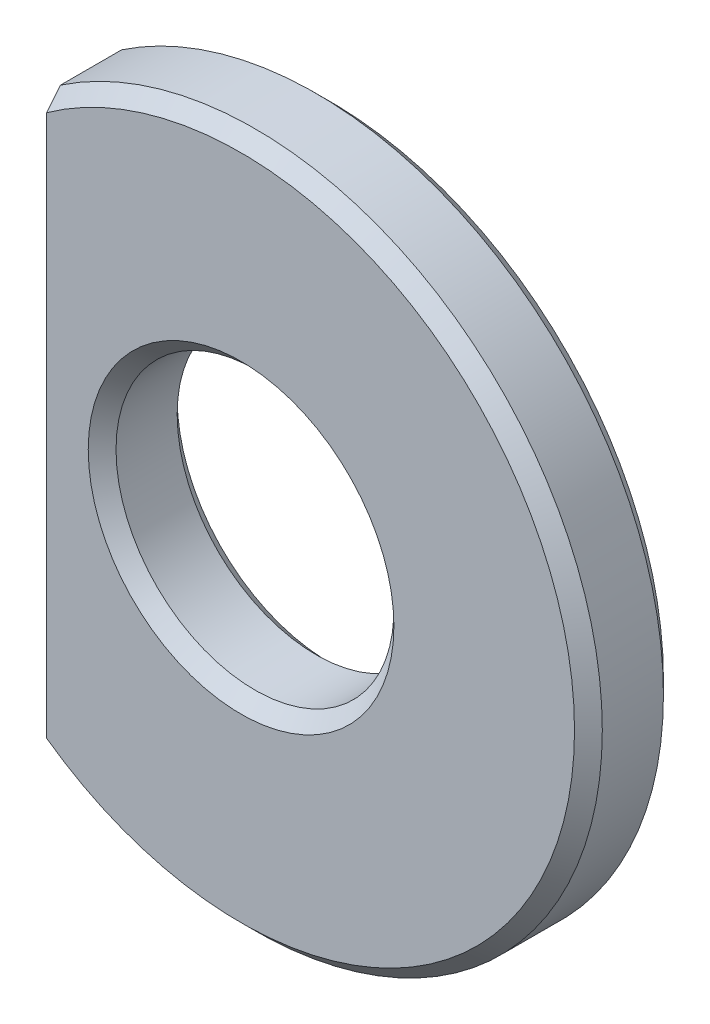
ISO-10303-21;
HEADER;
FILE_DESCRIPTION(('STEP AP214'),'2;1');
FILE_NAME('part.step','',(''),(''),'','','');
FILE_SCHEMA(('AUTOMOTIVE_DESIGN { 1 0 10303 214 1 1 1 1 }'));
ENDSEC;
DATA;
#1=APPLICATION_CONTEXT('core data for automotive mechanical design processes');
#2=APPLICATION_PROTOCOL_DEFINITION('international standard','automotive_design',2000,#1);
#3=PRODUCT_CONTEXT('',#1,'mechanical');
#4=PRODUCT('Part','Part','',(#3));
#5=PRODUCT_RELATED_PRODUCT_CATEGORY('part','',(#4));
#6=PRODUCT_DEFINITION_FORMATION('','',#4);
#7=PRODUCT_DEFINITION_CONTEXT('part definition',#1,'design');
#8=PRODUCT_DEFINITION('design','',#6,#7);
#9=PRODUCT_DEFINITION_SHAPE('','',#8);
#10=(LENGTH_UNIT() NAMED_UNIT(*) SI_UNIT(.MILLI.,.METRE.));
#11=(NAMED_UNIT(*) PLANE_ANGLE_UNIT() SI_UNIT($,.RADIAN.));
#12=(NAMED_UNIT(*) SI_UNIT($,.STERADIAN.) SOLID_ANGLE_UNIT());
#13=UNCERTAINTY_MEASURE_WITH_UNIT(LENGTH_MEASURE(1.E-05),#10,'distance_accuracy_value','');
#14=(GEOMETRIC_REPRESENTATION_CONTEXT(3) GLOBAL_UNCERTAINTY_ASSIGNED_CONTEXT((#13)) GLOBAL_UNIT_ASSIGNED_CONTEXT((#10,
#11,#12)) REPRESENTATION_CONTEXT('',''));
#15=CARTESIAN_POINT('',(0.,0.,0.));
#16=DIRECTION('',(0.,0.,1.));
#17=DIRECTION('',(1.,0.,0.));
#18=AXIS2_PLACEMENT_3D('',#15,#16,#17);
#19=CARTESIAN_POINT('',(0.,0.,-3.2));
#20=DIRECTION('',(0.,0.,-1.));
#21=DIRECTION('',(-1.,0.,0.));
#22=AXIS2_PLACEMENT_3D('',#19,#20,#21);
#23=CONICAL_SURFACE('',#22,5.5,0.785398163397447);
#24=CARTESIAN_POINT('',(0.,0.,-2.7));
#25=DIRECTION('',(0.,0.,-1.));
#26=DIRECTION('',(-1.,0.,0.));
#27=AXIS2_PLACEMENT_3D('',#24,#25,#26);
#28=CIRCLE('',#27,5.);
#29=CARTESIAN_POINT('',(-5.,0.,-2.7));
#30=VERTEX_POINT('',#29);
#31=EDGE_CURVE('E46',#30,#30,#28,.T.);
#32=ORIENTED_EDGE('',*,*,#31,.F.);
#33=EDGE_LOOP('',(#32));
#34=FACE_BOUND('',#33,.T.);
#35=CARTESIAN_POINT('',(0.,0.,-3.2));
#36=DIRECTION('',(0.,0.,-1.));
#37=DIRECTION('',(-1.,0.,0.));
#38=AXIS2_PLACEMENT_3D('',#35,#36,#37);
#39=CIRCLE('',#38,5.5);
#40=CARTESIAN_POINT('',(-5.5,0.,-3.2));
#41=VERTEX_POINT('',#40);
#42=EDGE_CURVE('E81',#41,#41,#39,.T.);
#43=ORIENTED_EDGE('',*,*,#42,.T.);
#44=EDGE_LOOP('',(#43));
#45=FACE_BOUND('',#44,.T.);
#46=ADVANCED_FACE('F39',(#34,#45),#23,.F.);
#47=CARTESIAN_POINT('',(0.,0.,3.));
#48=DIRECTION('',(0.,0.,-1.));
#49=DIRECTION('',(-1.,0.,0.));
#50=AXIS2_PLACEMENT_3D('',#47,#48,#49);
#51=CYLINDRICAL_SURFACE('',#50,5.);
#52=CARTESIAN_POINT('',(0.,0.,-0.5));
#53=DIRECTION('',(0.,0.,-1.));
#54=DIRECTION('',(-1.,0.,0.));
#55=AXIS2_PLACEMENT_3D('',#52,#53,#54);
#56=CIRCLE('',#55,5.);
#57=CARTESIAN_POINT('',(-5.,0.,-0.5));
#58=VERTEX_POINT('',#57);
#59=EDGE_CURVE('E100',#58,#58,#56,.T.);
#60=ORIENTED_EDGE('',*,*,#59,.F.);
#61=EDGE_LOOP('',(#60));
#62=FACE_BOUND('',#61,.T.);
#63=ORIENTED_EDGE('',*,*,#31,.T.);
#64=EDGE_LOOP('',(#63));
#65=FACE_BOUND('',#64,.T.);
#66=ADVANCED_FACE('F109',(#62,#65),#51,.F.);
#67=CARTESIAN_POINT('',(0.,0.,-0.5));
#68=DIRECTION('',(0.,0.,1.));
#69=DIRECTION('',(1.,0.,0.));
#70=AXIS2_PLACEMENT_3D('',#67,#68,#69);
#71=CONICAL_SURFACE('',#70,5.,0.785398163397448);
#72=CARTESIAN_POINT('',(0.,0.,0.));
#73=DIRECTION('',(0.,0.,-1.));
#74=DIRECTION('',(-1.,0.,0.));
#75=AXIS2_PLACEMENT_3D('',#72,#73,#74);
#76=CIRCLE('',#75,5.5);
#77=CARTESIAN_POINT('',(-5.5,0.,0.));
#78=VERTEX_POINT('',#77);
#79=EDGE_CURVE('E93',#78,#78,#76,.T.);
#80=ORIENTED_EDGE('',*,*,#79,.F.);
#81=EDGE_LOOP('',(#80));
#82=FACE_BOUND('',#81,.T.);
#83=ORIENTED_EDGE('',*,*,#59,.T.);
#84=EDGE_LOOP('',(#83));
#85=FACE_BOUND('',#84,.T.);
#86=ADVANCED_FACE('F164',(#82,#85),#71,.F.);
#87=CARTESIAN_POINT('',(5.5,0.,0.));
#88=DIRECTION('',(0.,0.,-1.));
#89=DIRECTION('',(-1.,0.,0.));
#90=AXIS2_PLACEMENT_3D('',#87,#88,#89);
#91=PLANE('',#90);
#92=CARTESIAN_POINT('',(0.,0.,0.));
#93=DIRECTION('',(0.,0.,-1.));
#94=DIRECTION('',(-1.,0.,0.));
#95=AXIS2_PLACEMENT_3D('',#92,#93,#94);
#96=CIRCLE('',#95,12.);
#97=CARTESIAN_POINT('',(-7.,9.74679434480896,0.));
#98=VERTEX_POINT('',#97);
#99=CARTESIAN_POINT('',(-7.,-9.74679434480896,0.));
#100=VERTEX_POINT('',#99);
#101=EDGE_CURVE('E89',#98,#100,#96,.T.);
#102=ORIENTED_EDGE('',*,*,#101,.F.);
#103=DIRECTION('',(0.,1.,0.));
#104=VECTOR('',#103,1.);
#105=CARTESIAN_POINT('',(-7.,-12.5,0.));
#106=LINE('',#105,#104);
#107=EDGE_CURVE('E77',#100,#98,#106,.T.);
#108=ORIENTED_EDGE('',*,*,#107,.F.);
#109=EDGE_LOOP('',(#102,#108));
#110=FACE_BOUND('',#109,.T.);
#111=ORIENTED_EDGE('',*,*,#79,.T.);
#112=EDGE_LOOP('',(#111));
#113=FACE_BOUND('',#112,.T.);
#114=ADVANCED_FACE('F88',(#110,#113),#91,.F.);
#115=CARTESIAN_POINT('',(0.,0.,0.));
#116=DIRECTION('',(0.,0.,-1.));
#117=DIRECTION('',(-1.,0.,0.));
#118=AXIS2_PLACEMENT_3D('',#115,#116,#117);
#119=CONICAL_SURFACE('',#118,12.,0.785398163397449);
#120=CARTESIAN_POINT('',(0.,0.,-0.5));
#121=DIRECTION('',(0.,0.,-1.));
#122=DIRECTION('',(-1.,0.,0.));
#123=AXIS2_PLACEMENT_3D('',#120,#121,#122);
#124=CIRCLE('',#123,12.5);
#125=CARTESIAN_POINT('',(-7.,10.356157588604,-0.5));
#126=VERTEX_POINT('',#125);
#127=CARTESIAN_POINT('',(-7.,-10.356157588604,-0.5));
#128=VERTEX_POINT('',#127);
#129=EDGE_CURVE('E92',#126,#128,#124,.T.);
#130=ORIENTED_EDGE('',*,*,#129,.F.);
#131=CARTESIAN_POINT('',(-7.,26.5974809660874,-15.50319970006));
#132=CARTESIAN_POINT('',(-7.,25.9975601645188,-14.9230677102815));
#133=CARTESIAN_POINT('',(-7.,25.397034098777,-14.3435595993783));
#134=CARTESIAN_POINT('',(-7.,24.1944142104764,-13.1861575101449));
#135=CARTESIAN_POINT('',(-7.,23.5923203682057,-12.6082635523008));
#136=CARTESIAN_POINT('',(-7.,22.3859206829967,-11.4541817687792));
#137=CARTESIAN_POINT('',(-7.,21.7816138828933,-10.8779949430382));
#138=CARTESIAN_POINT('',(-7.,20.5705923015512,-9.72816347357322));
#139=CARTESIAN_POINT('',(-7.,19.96387753549,-9.15451881387426));
#140=CARTESIAN_POINT('',(-7.,18.7592982521687,-8.02174047025647));
#141=CARTESIAN_POINT('',(-7.,18.1614937970523,-7.46254298391141));
#142=CARTESIAN_POINT('',(-7.,16.962017387273,-6.34831574624053));
#143=CARTESIAN_POINT('',(-7.,16.3603454583649,-5.79328596721406));
#144=CARTESIAN_POINT('',(-7.,15.1519700044687,-4.68897071579282));
#145=CARTESIAN_POINT('',(-7.,14.5452675674347,-4.13968405658092));
#146=CARTESIAN_POINT('',(-7.,13.6298908788917,-3.32172776162674));
#147=CARTESIAN_POINT('',(-7.,13.3238823328356,-3.05007492501876));
#148=CARTESIAN_POINT('',(-7.,12.7097423204301,-2.50918102955164));
#149=CARTESIAN_POINT('',(-7.,12.4016108714768,-2.23993995097081));
#150=CARTESIAN_POINT('',(-7.,11.9003389753215,-1.80611633640955));
#151=CARTESIAN_POINT('',(-7.,11.7079811956367,-1.64062944169334));
#152=CARTESIAN_POINT('',(-7.,11.3221618703078,-1.31094731436415));
#153=CARTESIAN_POINT('',(-7.,11.1287003243016,-1.14675208217482));
#154=CARTESIAN_POINT('',(-7.,10.5464167887475,-0.656341000157183));
#155=CARTESIAN_POINT('',(-7.,10.1557313100695,-0.332330516521065));
#156=CARTESIAN_POINT('',(-7.,9.36382680573523,0.31123271704682));
#157=CARTESIAN_POINT('',(-7.,8.96254022968294,0.630702835798519));
#158=CARTESIAN_POINT('',(-7.,8.35420120513129,1.10154501364449));
#159=CARTESIAN_POINT('',(-7.,8.15037356769272,1.25708378226441));
#160=CARTESIAN_POINT('',(-7.,7.74022545682281,1.56483468612607));
#161=CARTESIAN_POINT('',(-7.,7.53390505206734,1.71704691269117));
#162=CARTESIAN_POINT('',(-7.,7.11523062232355,2.01975562754734));
#163=CARTESIAN_POINT('',(-7.,6.90283253853249,2.17019132352292));
#164=CARTESIAN_POINT('',(-7.,6.4745641534718,2.46606053067388));
#165=CARTESIAN_POINT('',(-7.,6.25869378952942,2.6114939514119));
#166=CARTESIAN_POINT('',(-7.,5.82260003389805,2.89640880772308));
#167=CARTESIAN_POINT('',(-7.,5.60237081273649,3.03588135593903));
#168=CARTESIAN_POINT('',(-7.,5.15721608497063,3.30714522819117));
#169=CARTESIAN_POINT('',(-7.,4.93229072099411,3.43893678504915));
#170=CARTESIAN_POINT('',(-7.,4.47980838204535,3.69133872658569));
#171=CARTESIAN_POINT('',(-7.,4.25231697451592,3.81206588991167));
#172=CARTESIAN_POINT('',(-7.,3.79134582485489,4.04171129416059));
#173=CARTESIAN_POINT('',(-7.,3.55786499841368,4.1506273779104));
#174=CARTESIAN_POINT('',(-7.,3.08509834480397,4.35327758041434));
#175=CARTESIAN_POINT('',(-7.,2.84583034028318,4.44705281750604));
#176=CARTESIAN_POINT('',(-7.,2.36091134825294,4.61607472177995));
#177=CARTESIAN_POINT('',(-7.,2.1152646938125,4.69133362113134));
#178=CARTESIAN_POINT('',(-7.,1.63581231241523,4.81486498742003));
#179=CARTESIAN_POINT('',(-7.,1.40240884376861,4.86467739695852));
#180=CARTESIAN_POINT('',(-7.,0.931890799406263,4.94205114071705));
#181=CARTESIAN_POINT('',(-7.,0.694776562853737,4.96961449652609));
#182=CARTESIAN_POINT('',(-7.,0.219702419707357,5.0005504707432));
#183=CARTESIAN_POINT('',(-7.,-0.0182523889762398,5.00399984797934));
#184=CARTESIAN_POINT('',(-7.,-0.493278148736126,4.98665814437393));
#185=CARTESIAN_POINT('',(-7.,-0.730349026694275,4.96586510096683));
#186=CARTESIAN_POINT('',(-7.,-1.19933540872597,4.90177206777163));
#187=CARTESIAN_POINT('',(-7.,-1.43127749838393,4.85866276286873));
#188=CARTESIAN_POINT('',(-7.,-1.8905401424538,4.7526447175952));
#189=CARTESIAN_POINT('',(-7.,-2.11786013114811,4.6897335689423));
#190=CARTESIAN_POINT('',(-7.,-2.56843438301269,4.54675213937171));
#191=CARTESIAN_POINT('',(-7.,-2.79165734098455,4.46658426329127));
#192=CARTESIAN_POINT('',(-7.,-3.12226992391509,4.33590671933765));
#193=CARTESIAN_POINT('',(-7.,-3.2317658977974,4.29061206959605));
#194=CARTESIAN_POINT('',(-7.,-3.44940134829407,4.19687698700901));
#195=CARTESIAN_POINT('',(-7.,-3.55754085978457,4.14843663524164));
#196=CARTESIAN_POINT('',(-7.,-3.87994413476911,3.99889517560775));
#197=CARTESIAN_POINT('',(-7.,-4.0922459972695,3.89355224463993));
#198=CARTESIAN_POINT('',(-7.,-4.51208592461399,3.6737204156596));
#199=CARTESIAN_POINT('',(-7.,-4.7196226631824,3.559229010145));
#200=CARTESIAN_POINT('',(-7.,-5.13063533889408,3.32272254138141));
#201=CARTESIAN_POINT('',(-7.,-5.33410680178397,3.20069973432448));
#202=CARTESIAN_POINT('',(-7.,-5.73726730062288,2.95062175680441));
#203=CARTESIAN_POINT('',(-7.,-5.93695665983248,2.82256710518175));
#204=CARTESIAN_POINT('',(-7.,-6.33382530406013,2.5609861436243));
#205=CARTESIAN_POINT('',(-7.,-6.53099179067652,2.42744047291815));
#206=CARTESIAN_POINT('',(-7.,-6.92245239069194,2.15619631600509));
#207=CARTESIAN_POINT('',(-7.,-7.11674636394365,2.01849762816608));
#208=CARTESIAN_POINT('',(-7.,-7.69567076714519,1.60039266882191));
#209=CARTESIAN_POINT('',(-7.,-8.07657305001856,1.31482399469126));
#210=CARTESIAN_POINT('',(-7.,-8.83572979937891,0.730085863357861));
#211=CARTESIAN_POINT('',(-7.,-9.21388380550572,0.430787045448015));
#212=CARTESIAN_POINT('',(-7.,-9.96422653838401,-0.175258325366888));
#213=CARTESIAN_POINT('',(-7.,-10.3364146218818,-0.482005672533611));
#214=CARTESIAN_POINT('',(-7.,-11.0751951034769,-1.1003521271389));
#215=CARTESIAN_POINT('',(-7.,-11.4417988582866,-1.41193770550461));
#216=CARTESIAN_POINT('',(-7.,-12.1712887343344,-2.03943576936236));
#217=CARTESIAN_POINT('',(-7.,-12.5341747888011,-2.35534833233159));
#218=CARTESIAN_POINT('',(-7.,-13.4951812978538,-3.19992486029328));
#219=CARTESIAN_POINT('',(-7.,-14.0906858887581,-3.73156298145025));
#220=CARTESIAN_POINT('',(-7.,-15.2758146190573,-4.80136421660369));
#221=CARTESIAN_POINT('',(-7.,-15.8654385925428,-5.33952751375063));
#222=CARTESIAN_POINT('',(-7.,-17.0408535456441,-6.42112212114451));
#223=CARTESIAN_POINT('',(-7.,-17.6266404022274,-6.96455790696414));
#224=CARTESIAN_POINT('',(-7.,-18.794872471269,-8.05500897931172));
#225=CARTESIAN_POINT('',(-7.,-19.3773176725251,-8.6020242778262));
#226=CARTESIAN_POINT('',(-7.,-20.5156965067112,-9.67625045149411));
#227=CARTESIAN_POINT('',(-7.,-21.0717350331072,-10.2033502525246));
#228=CARTESIAN_POINT('',(-7.,-22.1818974452124,-11.2595656522967));
#229=CARTESIAN_POINT('',(-7.,-22.7360213233995,-11.7886812589407));
#230=CARTESIAN_POINT('',(-7.,-23.8420986257257,-12.847943398825));
#231=CARTESIAN_POINT('',(-7.,-24.3940537806209,-13.378088125717));
#232=CARTESIAN_POINT('',(-7.,-25.4966708036607,-14.43971190029));
#233=CARTESIAN_POINT('',(-7.,-26.047332682466,-14.9711909368968));
#234=CARTESIAN_POINT('',(-7.,-26.5974809660874,-15.50319970006));
#235=B_SPLINE_CURVE_WITH_KNOTS('',3,(#131,#132,#133,#134,#135,#136,#137,#138,#139,#140,#141,
#142,#143,#144,#145,#146,#147,#148,#149,#150,#151,#152,#153,#154,#155,#156,#157,#158,#159,#160,
#161,#162,#163,#164,#165,#166,#167,#168,#169,#170,#171,#172,#173,#174,#175,#176,#177,#178,#179,
#180,#181,#182,#183,#184,#185,#186,#187,#188,#189,#190,#191,#192,#193,#194,#195,#196,#197,#198,
#199,#200,#201,#202,#203,#204,#205,#206,#207,#208,#209,#210,#211,#212,#213,#214,#215,#216,#217,
#218,#219,#220,#221,#222,#223,#224,#225,#226,#227,#228,#229,#230,#231,#232,#233,#234),
.UNSPECIFIED.,.F.,.F.,(4,2,2,2,2,2,2,2,2,2,2,2,2,2,2,2,2,2,2,2,2,2,2,2,2,2,2,2,2,2,2,2,2,2,2,2,
2,2,2,2,2,2,2,2,2,2,2,2,2,2,2,4),(0.,2.50362360328026,5.00727883850257,7.51218852802978,
10.0170824541818,12.4728048205378,14.9285108504654,17.3836989586459,18.6112596947549,
19.8388103835454,20.6000456589194,21.3612811839601,22.8838929144224,24.4225059656763,
25.1916621838906,25.9607972599165,26.7415680409903,27.5223529303972,28.304263979446,
29.0861513153175,29.8585011763524,30.6309918624672,31.4013480480921,32.1711939501741,
32.8862254476241,33.6011919687118,34.3138815912089,35.0266289141002,35.7333841894707,
36.4402254530099,37.1511745072251,37.5066187287944,37.8620537926942,38.5727516673393,
39.2836450095283,39.9952818806495,40.7068576503677,41.4212036372409,42.1355843621529,
43.5635183612064,45.0102043118844,46.4570452109212,47.9003867238736,49.343754114572,
51.7385429364279,54.1333991322148,56.5305060210202,58.927620941004,61.226118084672,
63.5246242483364,65.8205685599131,68.1164938787406),.UNSPECIFIED.);
#236=EDGE_CURVE('E82',#126,#98,#235,.T.);
#237=ORIENTED_EDGE('',*,*,#236,.T.);
#238=ORIENTED_EDGE('',*,*,#101,.T.);
#239=EDGE_CURVE('E71',#100,#128,#235,.T.);
#240=ORIENTED_EDGE('',*,*,#239,.T.);
#241=EDGE_LOOP('',(#130,#237,#238,#240));
#242=FACE_BOUND('',#241,.T.);
#243=ADVANCED_FACE('F95',(#242),#119,.T.);
#244=CARTESIAN_POINT('',(0.,0.,3.));
#245=DIRECTION('',(0.,0.,-1.));
#246=DIRECTION('',(-1.,0.,0.));
#247=AXIS2_PLACEMENT_3D('',#244,#245,#246);
#248=CYLINDRICAL_SURFACE('',#247,12.5);
#249=ORIENTED_EDGE('',*,*,#129,.T.);
#250=DIRECTION('',(0.,0.,-1.));
#251=VECTOR('',#250,1.);
#252=CARTESIAN_POINT('',(-7.,-10.356157588604,3.));
#253=LINE('',#252,#251);
#254=CARTESIAN_POINT('',(-7.,-10.356157588604,-2.7));
#255=VERTEX_POINT('',#254);
#256=EDGE_CURVE('E56',#128,#255,#253,.T.);
#257=ORIENTED_EDGE('',*,*,#256,.T.);
#258=CARTESIAN_POINT('',(0.,0.,-2.7));
#259=DIRECTION('',(0.,0.,-1.));
#260=DIRECTION('',(-1.,0.,0.));
#261=AXIS2_PLACEMENT_3D('',#258,#259,#260);
#262=CIRCLE('',#261,12.5);
#263=CARTESIAN_POINT('',(-7.,10.356157588604,-2.7));
#264=VERTEX_POINT('',#263);
#265=EDGE_CURVE('E98',#264,#255,#262,.T.);
#266=ORIENTED_EDGE('',*,*,#265,.F.);
#267=DIRECTION('',(0.,0.,-1.));
#268=VECTOR('',#267,1.);
#269=CARTESIAN_POINT('',(-7.,10.356157588604,3.));
#270=LINE('',#269,#268);
#271=EDGE_CURVE('E129',#264,#126,#270,.F.);
#272=ORIENTED_EDGE('',*,*,#271,.T.);
#273=EDGE_LOOP('',(#249,#257,#266,#272));
#274=FACE_BOUND('',#273,.T.);
#275=ADVANCED_FACE('F126',(#274),#248,.T.);
#276=CARTESIAN_POINT('',(0.,0.,-2.7));
#277=DIRECTION('',(0.,0.,1.));
#278=DIRECTION('',(1.,0.,0.));
#279=AXIS2_PLACEMENT_3D('',#276,#277,#278);
#280=CONICAL_SURFACE('',#279,12.5,0.785398163397448);
#281=ORIENTED_EDGE('',*,*,#265,.T.);
#282=CARTESIAN_POINT('',(-7.,-26.5974809660874,12.30319970006));
#283=CARTESIAN_POINT('',(-7.,-25.9975601645188,11.7230677102815));
#284=CARTESIAN_POINT('',(-7.,-25.397034098777,11.1435595993783));
#285=CARTESIAN_POINT('',(-7.,-24.1944142104764,9.98615751014487));
#286=CARTESIAN_POINT('',(-7.,-23.5923203682057,9.40826355230084));
#287=CARTESIAN_POINT('',(-7.,-22.3859206829967,8.25418176877924));
#288=CARTESIAN_POINT('',(-7.,-21.7816138828933,7.67799494303815));
#289=CARTESIAN_POINT('',(-7.,-20.5705923015512,6.52816347357321));
#290=CARTESIAN_POINT('',(-7.,-19.96387753549,5.95451881387425));
#291=CARTESIAN_POINT('',(-7.,-18.7592982521687,4.82174047025647));
#292=CARTESIAN_POINT('',(-7.,-18.1614937970522,4.2625429839114));
#293=CARTESIAN_POINT('',(-7.,-16.962017387273,3.14831574624052));
#294=CARTESIAN_POINT('',(-7.,-16.3603454583648,2.59328596721404));
#295=CARTESIAN_POINT('',(-7.,-15.1519700044687,1.4889707157928));
#296=CARTESIAN_POINT('',(-7.,-14.5452675674347,0.939684056580899));
#297=CARTESIAN_POINT('',(-7.,-13.6298908788916,0.12172776162671));
#298=CARTESIAN_POINT('',(-7.,-13.3238823328356,-0.149925074981262));
#299=CARTESIAN_POINT('',(-7.,-12.70974232043,-0.690818970448387));
#300=CARTESIAN_POINT('',(-7.,-12.4016108714767,-0.96006004902922));
#301=CARTESIAN_POINT('',(-7.,-11.9003389753215,-1.39388366359048));
#302=CARTESIAN_POINT('',(-7.,-11.7079811956367,-1.55937055830669));
#303=CARTESIAN_POINT('',(-7.,-11.3221618703077,-1.88905268563588));
#304=CARTESIAN_POINT('',(-7.,-11.1287003243016,-2.0532479178252));
#305=CARTESIAN_POINT('',(-7.,-10.5464167887475,-2.54365899984284));
#306=CARTESIAN_POINT('',(-7.,-10.1557313100695,-2.86766948347896));
#307=CARTESIAN_POINT('',(-7.,-9.3638268057352,-3.51123271704684));
#308=CARTESIAN_POINT('',(-7.,-8.96254022968292,-3.83070283579854));
#309=CARTESIAN_POINT('',(-7.,-8.35420120513127,-4.30154501364451));
#310=CARTESIAN_POINT('',(-7.,-8.1503735676927,-4.45708378226443));
#311=CARTESIAN_POINT('',(-7.,-7.74022545682279,-4.76483468612609));
#312=CARTESIAN_POINT('',(-7.,-7.53390505206732,-4.91704691269119));
#313=CARTESIAN_POINT('',(-7.,-7.11523062232353,-5.21975562754736));
#314=CARTESIAN_POINT('',(-7.,-6.90283253853247,-5.37019132352294));
#315=CARTESIAN_POINT('',(-7.,-6.47456415347178,-5.66606053067389));
#316=CARTESIAN_POINT('',(-7.,-6.2586937895294,-5.81149395141191));
#317=CARTESIAN_POINT('',(-7.,-5.82260003389803,-6.0964088077231));
#318=CARTESIAN_POINT('',(-7.,-5.60237081273647,-6.23588135593904));
#319=CARTESIAN_POINT('',(-7.,-5.15721608497062,-6.50714522819118));
#320=CARTESIAN_POINT('',(-7.,-4.9322907209941,-6.63893678504916));
#321=CARTESIAN_POINT('',(-7.,-4.47980838204534,-6.8913387265857));
#322=CARTESIAN_POINT('',(-7.,-4.25231697451591,-7.01206588991168));
#323=CARTESIAN_POINT('',(-7.,-3.79134582485488,-7.2417112941606));
#324=CARTESIAN_POINT('',(-7.,-3.55786499841367,-7.35062737791041));
#325=CARTESIAN_POINT('',(-7.,-3.08509834480396,-7.55327758041435));
#326=CARTESIAN_POINT('',(-7.,-2.84583034028317,-7.64705281750605));
#327=CARTESIAN_POINT('',(-7.,-2.36091134825293,-7.81607472177996));
#328=CARTESIAN_POINT('',(-7.,-2.1152646938125,-7.89133362113135));
#329=CARTESIAN_POINT('',(-7.,-1.63581231241522,-8.01486498742003));
#330=CARTESIAN_POINT('',(-7.,-1.40240884376861,-8.06467739695853));
#331=CARTESIAN_POINT('',(-7.,-0.931890799406262,-8.14205114071706));
#332=CARTESIAN_POINT('',(-7.,-0.694776562853736,-8.1696144965261));
#333=CARTESIAN_POINT('',(-7.,-0.219702419707356,-8.20055047074321));
#334=CARTESIAN_POINT('',(-7.,0.0182523889762406,-8.20399984797934));
#335=CARTESIAN_POINT('',(-7.,0.493278148736127,-8.18665814437393));
#336=CARTESIAN_POINT('',(-7.,0.730349026694276,-8.16586510096684));
#337=CARTESIAN_POINT('',(-7.,1.19933540872597,-8.10177206777164));
#338=CARTESIAN_POINT('',(-7.,1.43127749838394,-8.05866276286874));
#339=CARTESIAN_POINT('',(-7.,1.8905401424538,-7.9526447175952));
#340=CARTESIAN_POINT('',(-7.,2.11786013114811,-7.88973356894231));
#341=CARTESIAN_POINT('',(-7.,2.56843438301269,-7.74675213937172));
#342=CARTESIAN_POINT('',(-7.,2.79165734098455,-7.66658426329128));
#343=CARTESIAN_POINT('',(-7.,3.12226992391509,-7.53590671933766));
#344=CARTESIAN_POINT('',(-7.,3.2317658977974,-7.49061206959605));
#345=CARTESIAN_POINT('',(-7.,3.44940134829407,-7.39687698700902));
#346=CARTESIAN_POINT('',(-7.,3.55754085978456,-7.34843663524165));
#347=CARTESIAN_POINT('',(-7.,3.87994413476911,-7.19889517560776));
#348=CARTESIAN_POINT('',(-7.,4.0922459972695,-7.09355224463993));
#349=CARTESIAN_POINT('',(-7.,4.51208592461398,-6.87372041565961));
#350=CARTESIAN_POINT('',(-7.,4.71962266318239,-6.75922901014501));
#351=CARTESIAN_POINT('',(-7.,5.13063533889407,-6.52272254138142));
#352=CARTESIAN_POINT('',(-7.,5.33410680178396,-6.40069973432449));
#353=CARTESIAN_POINT('',(-7.,5.73726730062287,-6.15062175680442));
#354=CARTESIAN_POINT('',(-7.,5.93695665983246,-6.02256710518176));
#355=CARTESIAN_POINT('',(-7.,6.33382530406012,-5.76098614362431));
#356=CARTESIAN_POINT('',(-7.,6.5309917906765,-5.62744047291817));
#357=CARTESIAN_POINT('',(-7.,6.92245239069192,-5.35619631600511));
#358=CARTESIAN_POINT('',(-7.,7.11674636394363,-5.2184976281661));
#359=CARTESIAN_POINT('',(-7.,7.69567076714517,-4.80039266882193));
#360=CARTESIAN_POINT('',(-7.,8.07657305001854,-4.51482399469127));
#361=CARTESIAN_POINT('',(-7.,8.83572979937889,-3.93008586335788));
#362=CARTESIAN_POINT('',(-7.,9.2138838055057,-3.63078704544803));
#363=CARTESIAN_POINT('',(-7.,9.96422653838399,-3.02474167463313));
#364=CARTESIAN_POINT('',(-7.,10.3364146218818,-2.71799432746641));
#365=CARTESIAN_POINT('',(-7.,11.0751951034769,-2.09964787286112));
#366=CARTESIAN_POINT('',(-7.,11.4417988582865,-1.78806229449541));
#367=CARTESIAN_POINT('',(-7.,12.1712887343343,-1.16056423063766));
#368=CARTESIAN_POINT('',(-7.,12.534174788801,-0.844651667668429));
#369=CARTESIAN_POINT('',(-7.,13.4951812978537,-7.51397067451842E-05));
#370=CARTESIAN_POINT('',(-7.,14.0906858887581,0.531562981450231));
#371=CARTESIAN_POINT('',(-7.,15.2758146190573,1.60136421660367));
#372=CARTESIAN_POINT('',(-7.,15.8654385925428,2.13952751375061));
#373=CARTESIAN_POINT('',(-7.,17.0408535456441,3.22112212114449));
#374=CARTESIAN_POINT('',(-7.,17.6266404022274,3.76455790696412));
#375=CARTESIAN_POINT('',(-7.,18.794872471269,4.8550089793117));
#376=CARTESIAN_POINT('',(-7.,19.377317672525,5.40202427782618));
#377=CARTESIAN_POINT('',(-7.,20.5156965067112,6.4762504514941));
#378=CARTESIAN_POINT('',(-7.,21.0717350331071,7.00335025252463));
#379=CARTESIAN_POINT('',(-7.,22.1818974452124,8.0595656522967));
#380=CARTESIAN_POINT('',(-7.,22.7360213233995,8.58868125894071));
#381=CARTESIAN_POINT('',(-7.,23.8420986257257,9.64794339882495));
#382=CARTESIAN_POINT('',(-7.,24.3940537806209,10.178088125717));
#383=CARTESIAN_POINT('',(-7.,25.4966708036607,11.23971190029));
#384=CARTESIAN_POINT('',(-7.,26.047332682466,11.7711909368968));
#385=CARTESIAN_POINT('',(-7.,26.5974809660874,12.30319970006));
#386=B_SPLINE_CURVE_WITH_KNOTS('',3,(#282,#283,#284,#285,#286,#287,#288,#289,#290,#291,#292,
#293,#294,#295,#296,#297,#298,#299,#300,#301,#302,#303,#304,#305,#306,#307,#308,#309,#310,#311,
#312,#313,#314,#315,#316,#317,#318,#319,#320,#321,#322,#323,#324,#325,#326,#327,#328,#329,#330,
#331,#332,#333,#334,#335,#336,#337,#338,#339,#340,#341,#342,#343,#344,#345,#346,#347,#348,#349,
#350,#351,#352,#353,#354,#355,#356,#357,#358,#359,#360,#361,#362,#363,#364,#365,#366,#367,#368,
#369,#370,#371,#372,#373,#374,#375,#376,#377,#378,#379,#380,#381,#382,#383,#384,#385),
.UNSPECIFIED.,.F.,.F.,(4,2,2,2,2,2,2,2,2,2,2,2,2,2,2,2,2,2,2,2,2,2,2,2,2,2,2,2,2,2,2,2,2,2,2,2,
2,2,2,2,2,2,2,2,2,2,2,2,2,2,2,4),(0.,2.50362360328026,5.00727883850258,7.51218852802978,
10.0170824541818,12.4728048205378,14.9285108504655,17.3836989586459,18.6112596947549,
19.8388103835454,20.6000456589194,21.3612811839601,22.8838929144224,24.4225059656763,
25.1916621838906,25.9607972599165,26.7415680409903,27.5223529303972,28.304263979446,
29.0861513153175,29.8585011763524,30.6309918624672,31.4013480480921,32.1711939501741,
32.886225447624,33.6011919687118,34.3138815912089,35.0266289141001,35.7333841894707,
36.4402254530099,37.1511745072251,37.5066187287944,37.8620537926942,38.5727516673393,
39.2836450095282,39.9952818806494,40.7068576503677,41.4212036372408,42.1355843621529,
43.5635183612064,45.0102043118844,46.4570452109212,47.9003867238736,49.343754114572,
51.7385429364279,54.1333991322147,56.5305060210201,58.927620941004,61.226118084672,
63.5246242483364,65.8205685599131,68.1164938787406),.UNSPECIFIED.);
#387=CARTESIAN_POINT('',(-7.,-9.74679434480896,-3.2));
#388=VERTEX_POINT('',#387);
#389=EDGE_CURVE('E124',#255,#388,#386,.T.);
#390=ORIENTED_EDGE('',*,*,#389,.T.);
#391=CARTESIAN_POINT('',(0.,0.,-3.2));
#392=DIRECTION('',(0.,0.,-1.));
#393=DIRECTION('',(-1.,0.,0.));
#394=AXIS2_PLACEMENT_3D('',#391,#392,#393);
#395=CIRCLE('',#394,12.);
#396=CARTESIAN_POINT('',(-7.,9.74679434480896,-3.2));
#397=VERTEX_POINT('',#396);
#398=EDGE_CURVE('E114',#397,#388,#395,.T.);
#399=ORIENTED_EDGE('',*,*,#398,.F.);
#400=EDGE_CURVE('E52',#397,#264,#386,.T.);
#401=ORIENTED_EDGE('',*,*,#400,.T.);
#402=EDGE_LOOP('',(#281,#390,#399,#401));
#403=FACE_BOUND('',#402,.T.);
#404=ADVANCED_FACE('F121',(#403),#280,.T.);
#405=CARTESIAN_POINT('',(12.,0.,-3.2));
#406=DIRECTION('',(0.,0.,1.));
#407=DIRECTION('',(1.,0.,0.));
#408=AXIS2_PLACEMENT_3D('',#405,#406,#407);
#409=PLANE('',#408);
#410=ORIENTED_EDGE('',*,*,#42,.F.);
#411=EDGE_LOOP('',(#410));
#412=FACE_BOUND('',#411,.T.);
#413=ORIENTED_EDGE('',*,*,#398,.T.);
#414=DIRECTION('',(0.,1.,0.));
#415=VECTOR('',#414,1.);
#416=CARTESIAN_POINT('',(-7.,0.,-3.2));
#417=LINE('',#416,#415);
#418=EDGE_CURVE('E11',#388,#397,#417,.T.);
#419=ORIENTED_EDGE('',*,*,#418,.T.);
#420=EDGE_LOOP('',(#413,#419));
#421=FACE_BOUND('',#420,.T.);
#422=ADVANCED_FACE('F146',(#412,#421),#409,.F.);
#423=CARTESIAN_POINT('',(-7.,-12.5,-3.2));
#424=DIRECTION('',(1.,0.,0.));
#425=DIRECTION('',(0.,0.,-1.));
#426=AXIS2_PLACEMENT_3D('',#423,#424,#425);
#427=PLANE('',#426);
#428=ORIENTED_EDGE('',*,*,#107,.T.);
#429=ORIENTED_EDGE('',*,*,#236,.F.);
#430=ORIENTED_EDGE('',*,*,#271,.F.);
#431=ORIENTED_EDGE('',*,*,#400,.F.);
#432=ORIENTED_EDGE('',*,*,#418,.F.);
#433=ORIENTED_EDGE('',*,*,#389,.F.);
#434=ORIENTED_EDGE('',*,*,#256,.F.);
#435=ORIENTED_EDGE('',*,*,#239,.F.);
#436=EDGE_LOOP('',(#428,#429,#430,#431,#432,#433,#434,#435));
#437=FACE_BOUND('',#436,.T.);
#438=ADVANCED_FACE('F78',(#437),#427,.F.);
#439=CLOSED_SHELL('',(#46,#66,#86,#114,#243,#275,#404,#422,#438));
#440=MANIFOLD_SOLID_BREP('B2',#439);
#441=ADVANCED_BREP_SHAPE_REPRESENTATION('',(#18,#440),#14);
#442=SHAPE_DEFINITION_REPRESENTATION(#9,#441);
ENDSEC;
END-ISO-10303-21;
